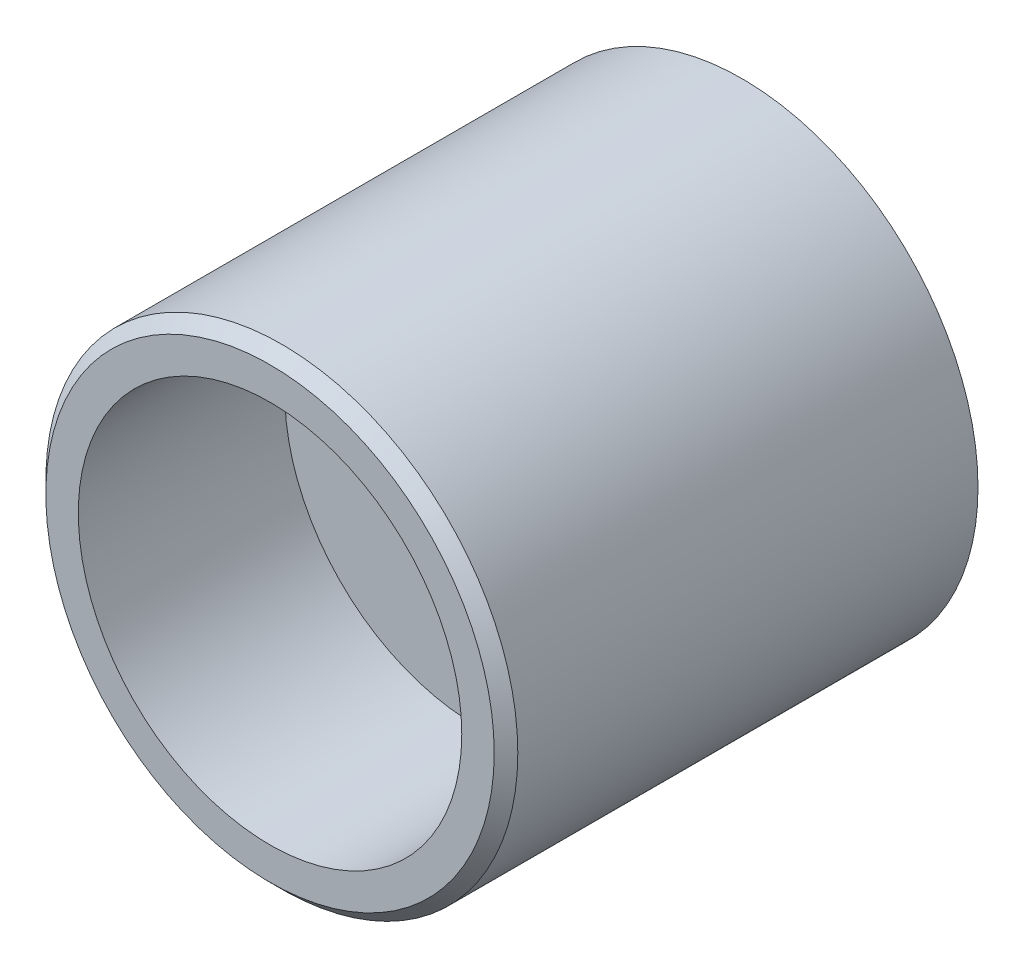
ISO-10303-21;
HEADER;
FILE_DESCRIPTION(('STEP AP214'),'2;1');
FILE_NAME('part.step','',(''),(''),'','','');
FILE_SCHEMA(('AUTOMOTIVE_DESIGN { 1 0 10303 214 1 1 1 1 }'));
ENDSEC;
DATA;
#1=APPLICATION_CONTEXT('core data for automotive mechanical design processes');
#2=APPLICATION_PROTOCOL_DEFINITION('international standard','automotive_design',2000,#1);
#3=PRODUCT_CONTEXT('',#1,'mechanical');
#4=PRODUCT('Part','Part','',(#3));
#5=PRODUCT_RELATED_PRODUCT_CATEGORY('part','',(#4));
#6=PRODUCT_DEFINITION_FORMATION('','',#4);
#7=PRODUCT_DEFINITION_CONTEXT('part definition',#1,'design');
#8=PRODUCT_DEFINITION('design','',#6,#7);
#9=PRODUCT_DEFINITION_SHAPE('','',#8);
#10=(LENGTH_UNIT() NAMED_UNIT(*) SI_UNIT(.MILLI.,.METRE.));
#11=(NAMED_UNIT(*) PLANE_ANGLE_UNIT() SI_UNIT($,.RADIAN.));
#12=(NAMED_UNIT(*) SI_UNIT($,.STERADIAN.) SOLID_ANGLE_UNIT());
#13=UNCERTAINTY_MEASURE_WITH_UNIT(LENGTH_MEASURE(1.E-05),#10,'distance_accuracy_value','');
#14=(GEOMETRIC_REPRESENTATION_CONTEXT(3) GLOBAL_UNCERTAINTY_ASSIGNED_CONTEXT((#13)) GLOBAL_UNIT_ASSIGNED_CONTEXT((#10,
#11,#12)) REPRESENTATION_CONTEXT('',''));
#15=CARTESIAN_POINT('',(0.,0.,0.));
#16=DIRECTION('',(0.,0.,1.));
#17=DIRECTION('',(1.,0.,0.));
#18=AXIS2_PLACEMENT_3D('',#15,#16,#17);
#19=CARTESIAN_POINT('',(0.,0.,8.));
#20=DIRECTION('',(0.,0.,-1.));
#21=DIRECTION('',(-1.,0.,0.));
#22=AXIS2_PLACEMENT_3D('',#19,#20,#21);
#23=CYLINDRICAL_SURFACE('',#22,4.);
#24=CARTESIAN_POINT('',(0.,0.,7.8));
#25=DIRECTION('',(0.,0.,1.));
#26=DIRECTION('',(1.,0.,0.));
#27=AXIS2_PLACEMENT_3D('',#24,#25,#26);
#28=CIRCLE('',#27,4.);
#29=CARTESIAN_POINT('',(4.,0.,7.8));
#30=VERTEX_POINT('',#29);
#31=EDGE_CURVE('E10',#30,#30,#28,.F.);
#32=ORIENTED_EDGE('',*,*,#31,.T.);
#33=EDGE_LOOP('',(#32));
#34=FACE_BOUND('',#33,.T.);
#35=CARTESIAN_POINT('',(0.,0.,0.));
#36=DIRECTION('',(0.,0.,1.));
#37=DIRECTION('',(1.,0.,0.));
#38=AXIS2_PLACEMENT_3D('',#35,#36,#37);
#39=CIRCLE('',#38,4.);
#40=CARTESIAN_POINT('',(4.,0.,0.));
#41=VERTEX_POINT('',#40);
#42=EDGE_CURVE('E41',#41,#41,#39,.T.);
#43=ORIENTED_EDGE('',*,*,#42,.T.);
#44=EDGE_LOOP('',(#43));
#45=FACE_BOUND('',#44,.T.);
#46=ADVANCED_FACE('F30',(#34,#45),#23,.T.);
#47=CARTESIAN_POINT('',(0.,0.,8.));
#48=DIRECTION('',(0.,0.,1.));
#49=DIRECTION('',(1.,0.,0.));
#50=AXIS2_PLACEMENT_3D('',#47,#48,#49);
#51=PLANE('',#50);
#52=CARTESIAN_POINT('',(0.,0.,8.));
#53=DIRECTION('',(0.,0.,1.));
#54=DIRECTION('',(1.,0.,0.));
#55=AXIS2_PLACEMENT_3D('',#52,#53,#54);
#56=CIRCLE('',#55,3.8);
#57=CARTESIAN_POINT('',(3.8,0.,8.));
#58=VERTEX_POINT('',#57);
#59=EDGE_CURVE('E37',#58,#58,#56,.T.);
#60=ORIENTED_EDGE('',*,*,#59,.T.);
#61=EDGE_LOOP('',(#60));
#62=FACE_BOUND('',#61,.T.);
#63=CARTESIAN_POINT('',(0.,0.,8.));
#64=DIRECTION('',(0.,0.,1.));
#65=DIRECTION('',(1.,0.,0.));
#66=AXIS2_PLACEMENT_3D('',#63,#64,#65);
#67=CIRCLE('',#66,3.25);
#68=CARTESIAN_POINT('',(3.25,0.,8.));
#69=VERTEX_POINT('',#68);
#70=EDGE_CURVE('E56',#69,#69,#67,.T.);
#71=ORIENTED_EDGE('',*,*,#70,.F.);
#72=EDGE_LOOP('',(#71));
#73=FACE_BOUND('',#72,.T.);
#74=ADVANCED_FACE('F62',(#62,#73),#51,.T.);
#75=CARTESIAN_POINT('',(0.,0.,0.));
#76=DIRECTION('',(0.,0.,1.));
#77=DIRECTION('',(1.,0.,0.));
#78=AXIS2_PLACEMENT_3D('',#75,#76,#77);
#79=PLANE('',#78);
#80=CARTESIAN_POINT('',(0.,0.,0.));
#81=DIRECTION('',(0.,0.,1.));
#82=DIRECTION('',(1.,0.,0.));
#83=AXIS2_PLACEMENT_3D('',#80,#81,#82);
#84=CIRCLE('',#83,1.7);
#85=CARTESIAN_POINT('',(1.7,0.,0.));
#86=VERTEX_POINT('',#85);
#87=EDGE_CURVE('E45',#86,#86,#84,.T.);
#88=ORIENTED_EDGE('',*,*,#87,.T.);
#89=EDGE_LOOP('',(#88));
#90=FACE_BOUND('',#89,.T.);
#91=ORIENTED_EDGE('',*,*,#42,.F.);
#92=EDGE_LOOP('',(#91));
#93=FACE_BOUND('',#92,.T.);
#94=ADVANCED_FACE('F64',(#90,#93),#79,.F.);
#95=CARTESIAN_POINT('',(0.,0.,8.));
#96=DIRECTION('',(0.,0.,1.));
#97=DIRECTION('',(1.,0.,0.));
#98=AXIS2_PLACEMENT_3D('',#95,#96,#97);
#99=CYLINDRICAL_SURFACE('',#98,1.7);
#100=ORIENTED_EDGE('',*,*,#87,.F.);
#101=EDGE_LOOP('',(#100));
#102=FACE_BOUND('',#101,.T.);
#103=CARTESIAN_POINT('',(0.,0.,4.5));
#104=DIRECTION('',(0.,0.,1.));
#105=DIRECTION('',(1.,0.,0.));
#106=AXIS2_PLACEMENT_3D('',#103,#104,#105);
#107=CIRCLE('',#106,1.7);
#108=CARTESIAN_POINT('',(1.7,0.,4.5));
#109=VERTEX_POINT('',#108);
#110=EDGE_CURVE('E50',#109,#109,#107,.T.);
#111=ORIENTED_EDGE('',*,*,#110,.T.);
#112=EDGE_LOOP('',(#111));
#113=FACE_BOUND('',#112,.T.);
#114=ADVANCED_FACE('F70',(#102,#113),#99,.F.);
#115=CARTESIAN_POINT('',(1.7,0.,4.5));
#116=DIRECTION('',(0.,0.,-1.));
#117=DIRECTION('',(-1.,0.,0.));
#118=AXIS2_PLACEMENT_3D('',#115,#116,#117);
#119=PLANE('',#118);
#120=ORIENTED_EDGE('',*,*,#110,.F.);
#121=EDGE_LOOP('',(#120));
#122=FACE_BOUND('',#121,.T.);
#123=CARTESIAN_POINT('',(0.,0.,4.5));
#124=DIRECTION('',(0.,0.,1.));
#125=DIRECTION('',(1.,0.,0.));
#126=AXIS2_PLACEMENT_3D('',#123,#124,#125);
#127=CIRCLE('',#126,3.25);
#128=CARTESIAN_POINT('',(3.25,0.,4.5));
#129=VERTEX_POINT('',#128);
#130=EDGE_CURVE('E53',#129,#129,#127,.T.);
#131=ORIENTED_EDGE('',*,*,#130,.T.);
#132=EDGE_LOOP('',(#131));
#133=FACE_BOUND('',#132,.T.);
#134=ADVANCED_FACE('F76',(#122,#133),#119,.F.);
#135=CARTESIAN_POINT('',(0.,0.,8.));
#136=DIRECTION('',(0.,0.,1.));
#137=DIRECTION('',(1.,0.,0.));
#138=AXIS2_PLACEMENT_3D('',#135,#136,#137);
#139=CYLINDRICAL_SURFACE('',#138,3.25);
#140=ORIENTED_EDGE('',*,*,#130,.F.);
#141=EDGE_LOOP('',(#140));
#142=FACE_BOUND('',#141,.T.);
#143=ORIENTED_EDGE('',*,*,#70,.T.);
#144=EDGE_LOOP('',(#143));
#145=FACE_BOUND('',#144,.T.);
#146=ADVANCED_FACE('F60',(#142,#145),#139,.F.);
#147=CARTESIAN_POINT('',(0.,0.,8.));
#148=DIRECTION('',(0.,0.,-1.));
#149=DIRECTION('',(-1.,0.,0.));
#150=AXIS2_PLACEMENT_3D('',#147,#148,#149);
#151=CONICAL_SURFACE('',#150,3.8,0.785398163397448);
#152=ORIENTED_EDGE('',*,*,#31,.F.);
#153=EDGE_LOOP('',(#152));
#154=FACE_BOUND('',#153,.T.);
#155=ORIENTED_EDGE('',*,*,#59,.F.);
#156=EDGE_LOOP('',(#155));
#157=FACE_BOUND('',#156,.T.);
#158=ADVANCED_FACE('F32',(#154,#157),#151,.T.);
#159=CLOSED_SHELL('',(#46,#74,#94,#114,#134,#146,#158));
#160=MANIFOLD_SOLID_BREP('B2',#159);
#161=ADVANCED_BREP_SHAPE_REPRESENTATION('',(#18,#160),#14);
#162=SHAPE_DEFINITION_REPRESENTATION(#9,#161);
ENDSEC;
END-ISO-10303-21;
